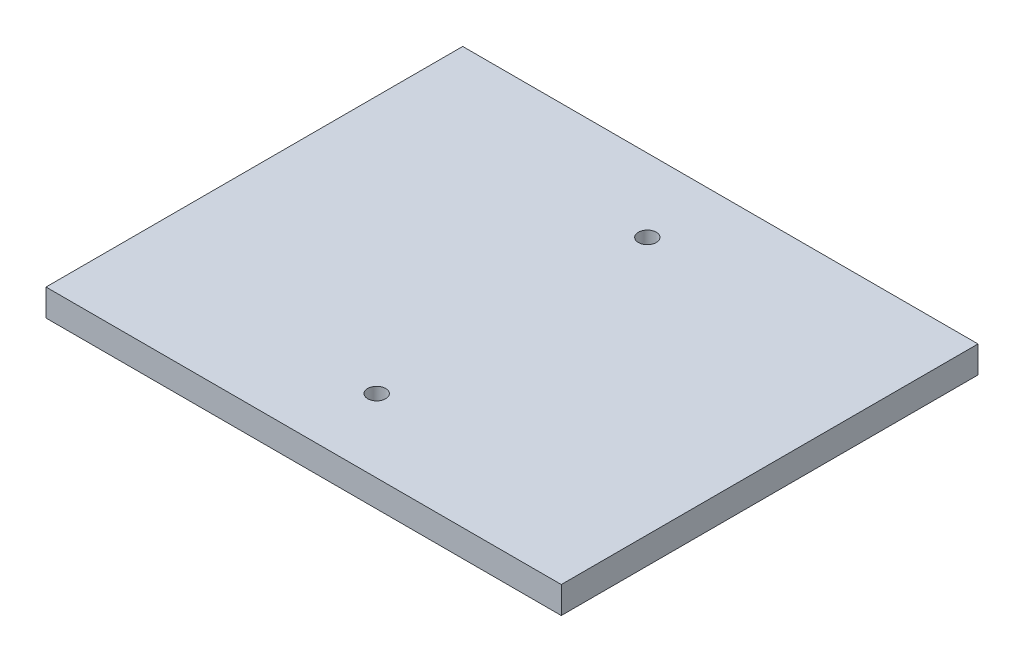
ISO-10303-21;
HEADER;
FILE_DESCRIPTION(('STEP AP214'),'2;1');
FILE_NAME('part.step','',(''),(''),'','','');
FILE_SCHEMA(('AUTOMOTIVE_DESIGN { 1 0 10303 214 1 1 1 1 }'));
ENDSEC;
DATA;
#1=APPLICATION_CONTEXT('core data for automotive mechanical design processes');
#2=APPLICATION_PROTOCOL_DEFINITION('international standard','automotive_design',2000,#1);
#3=PRODUCT_CONTEXT('',#1,'mechanical');
#4=PRODUCT('Part','Part','',(#3));
#5=PRODUCT_RELATED_PRODUCT_CATEGORY('part','',(#4));
#6=PRODUCT_DEFINITION_FORMATION('','',#4);
#7=PRODUCT_DEFINITION_CONTEXT('part definition',#1,'design');
#8=PRODUCT_DEFINITION('design','',#6,#7);
#9=PRODUCT_DEFINITION_SHAPE('','',#8);
#10=(LENGTH_UNIT() NAMED_UNIT(*) SI_UNIT(.MILLI.,.METRE.));
#11=(NAMED_UNIT(*) PLANE_ANGLE_UNIT() SI_UNIT($,.RADIAN.));
#12=(NAMED_UNIT(*) SI_UNIT($,.STERADIAN.) SOLID_ANGLE_UNIT());
#13=UNCERTAINTY_MEASURE_WITH_UNIT(LENGTH_MEASURE(1.E-05),#10,'distance_accuracy_value','');
#14=(GEOMETRIC_REPRESENTATION_CONTEXT(3) GLOBAL_UNCERTAINTY_ASSIGNED_CONTEXT((#13)) GLOBAL_UNIT_ASSIGNED_CONTEXT((#10,
#11,#12)) REPRESENTATION_CONTEXT('',''));
#15=CARTESIAN_POINT('',(0.,0.,0.));
#16=DIRECTION('',(0.,0.,1.));
#17=DIRECTION('',(1.,0.,0.));
#18=AXIS2_PLACEMENT_3D('',#15,#16,#17);
#19=CARTESIAN_POINT('',(-28.75,3.,23.25));
#20=DIRECTION('',(-1.,0.,0.));
#21=DIRECTION('',(0.,0.,1.));
#22=AXIS2_PLACEMENT_3D('',#19,#20,#21);
#23=PLANE('',#22);
#24=DIRECTION('',(0.,0.,-1.));
#25=VECTOR('',#24,1.);
#26=CARTESIAN_POINT('',(-28.75,0.,23.25));
#27=LINE('',#26,#25);
#28=CARTESIAN_POINT('',(-28.75,0.,23.25));
#29=VERTEX_POINT('',#28);
#30=CARTESIAN_POINT('',(-28.75,0.,-23.25));
#31=VERTEX_POINT('',#30);
#32=EDGE_CURVE('E105',#29,#31,#27,.T.);
#33=ORIENTED_EDGE('',*,*,#32,.F.);
#34=DIRECTION('',(0.,-1.,0.));
#35=VECTOR('',#34,1.);
#36=CARTESIAN_POINT('',(-28.75,3.,23.25));
#37=LINE('',#36,#35);
#38=CARTESIAN_POINT('',(-28.75,3.,23.25));
#39=VERTEX_POINT('',#38);
#40=EDGE_CURVE('E11',#39,#29,#37,.T.);
#41=ORIENTED_EDGE('',*,*,#40,.F.);
#42=DIRECTION('',(0.,0.,-1.));
#43=VECTOR('',#42,1.);
#44=CARTESIAN_POINT('',(-28.75,3.,23.25));
#45=LINE('',#44,#43);
#46=CARTESIAN_POINT('',(-28.75,3.,-23.25));
#47=VERTEX_POINT('',#46);
#48=EDGE_CURVE('E99',#39,#47,#45,.T.);
#49=ORIENTED_EDGE('',*,*,#48,.T.);
#50=DIRECTION('',(0.,-1.,0.));
#51=VECTOR('',#50,1.);
#52=CARTESIAN_POINT('',(-28.75,3.,-23.25));
#53=LINE('',#52,#51);
#54=EDGE_CURVE('E42',#47,#31,#53,.T.);
#55=ORIENTED_EDGE('',*,*,#54,.T.);
#56=EDGE_LOOP('',(#33,#41,#49,#55));
#57=FACE_BOUND('',#56,.T.);
#58=ADVANCED_FACE('F39',(#57),#23,.T.);
#59=CARTESIAN_POINT('',(-28.75,3.,23.25));
#60=DIRECTION('',(0.,0.,-1.));
#61=DIRECTION('',(-1.,0.,0.));
#62=AXIS2_PLACEMENT_3D('',#59,#60,#61);
#63=PLANE('',#62);
#64=DIRECTION('',(1.,0.,0.));
#65=VECTOR('',#64,1.);
#66=CARTESIAN_POINT('',(-28.75,0.,23.25));
#67=LINE('',#66,#65);
#68=CARTESIAN_POINT('',(28.75,0.,23.25));
#69=VERTEX_POINT('',#68);
#70=EDGE_CURVE('E72',#29,#69,#67,.T.);
#71=ORIENTED_EDGE('',*,*,#70,.T.);
#72=DIRECTION('',(0.,-1.,0.));
#73=VECTOR('',#72,1.);
#74=CARTESIAN_POINT('',(28.75,3.,23.25));
#75=LINE('',#74,#73);
#76=CARTESIAN_POINT('',(28.75,3.,23.25));
#77=VERTEX_POINT('',#76);
#78=EDGE_CURVE('E48',#77,#69,#75,.T.);
#79=ORIENTED_EDGE('',*,*,#78,.F.);
#80=DIRECTION('',(1.,0.,0.));
#81=VECTOR('',#80,1.);
#82=CARTESIAN_POINT('',(-28.75,3.,23.25));
#83=LINE('',#82,#81);
#84=EDGE_CURVE('E89',#39,#77,#83,.T.);
#85=ORIENTED_EDGE('',*,*,#84,.F.);
#86=ORIENTED_EDGE('',*,*,#40,.T.);
#87=EDGE_LOOP('',(#71,#79,#85,#86));
#88=FACE_BOUND('',#87,.T.);
#89=ADVANCED_FACE('F116',(#88),#63,.F.);
#90=CARTESIAN_POINT('',(28.75,3.,23.25));
#91=DIRECTION('',(-1.,0.,0.));
#92=DIRECTION('',(0.,0.,1.));
#93=AXIS2_PLACEMENT_3D('',#90,#91,#92);
#94=PLANE('',#93);
#95=DIRECTION('',(0.,0.,-1.));
#96=VECTOR('',#95,1.);
#97=CARTESIAN_POINT('',(28.75,0.,23.25));
#98=LINE('',#97,#96);
#99=CARTESIAN_POINT('',(28.75,0.,-23.25));
#100=VERTEX_POINT('',#99);
#101=EDGE_CURVE('E96',#69,#100,#98,.T.);
#102=ORIENTED_EDGE('',*,*,#101,.T.);
#103=DIRECTION('',(0.,-1.,0.));
#104=VECTOR('',#103,1.);
#105=CARTESIAN_POINT('',(28.75,3.,-23.25));
#106=LINE('',#105,#104);
#107=CARTESIAN_POINT('',(28.75,3.,-23.25));
#108=VERTEX_POINT('',#107);
#109=EDGE_CURVE('E93',#108,#100,#106,.T.);
#110=ORIENTED_EDGE('',*,*,#109,.F.);
#111=DIRECTION('',(0.,0.,-1.));
#112=VECTOR('',#111,1.);
#113=CARTESIAN_POINT('',(28.75,3.,23.25));
#114=LINE('',#113,#112);
#115=EDGE_CURVE('E84',#77,#108,#114,.T.);
#116=ORIENTED_EDGE('',*,*,#115,.F.);
#117=ORIENTED_EDGE('',*,*,#78,.T.);
#118=EDGE_LOOP('',(#102,#110,#116,#117));
#119=FACE_BOUND('',#118,.T.);
#120=ADVANCED_FACE('F94',(#119),#94,.F.);
#121=CARTESIAN_POINT('',(-28.75,3.,-23.25));
#122=DIRECTION('',(0.,0.,-1.));
#123=DIRECTION('',(-1.,0.,0.));
#124=AXIS2_PLACEMENT_3D('',#121,#122,#123);
#125=PLANE('',#124);
#126=DIRECTION('',(1.,0.,0.));
#127=VECTOR('',#126,1.);
#128=CARTESIAN_POINT('',(-28.75,0.,-23.25));
#129=LINE('',#128,#127);
#130=EDGE_CURVE('E108',#31,#100,#129,.T.);
#131=ORIENTED_EDGE('',*,*,#130,.F.);
#132=ORIENTED_EDGE('',*,*,#54,.F.);
#133=DIRECTION('',(1.,0.,0.));
#134=VECTOR('',#133,1.);
#135=CARTESIAN_POINT('',(-28.75,3.,-23.25));
#136=LINE('',#135,#134);
#137=EDGE_CURVE('E88',#47,#108,#136,.T.);
#138=ORIENTED_EDGE('',*,*,#137,.T.);
#139=ORIENTED_EDGE('',*,*,#109,.T.);
#140=EDGE_LOOP('',(#131,#132,#138,#139));
#141=FACE_BOUND('',#140,.T.);
#142=ADVANCED_FACE('F98',(#141),#125,.T.);
#143=CARTESIAN_POINT('',(0.,3.,0.));
#144=DIRECTION('',(0.,-1.,0.));
#145=DIRECTION('',(0.,0.,-1.));
#146=AXIS2_PLACEMENT_3D('',#143,#144,#145);
#147=PLANE('',#146);
#148=CARTESIAN_POINT('',(0.,3.,15.1));
#149=DIRECTION('',(0.,1.,0.));
#150=DIRECTION('',(0.,0.,1.));
#151=AXIS2_PLACEMENT_3D('',#148,#149,#150);
#152=CIRCLE('',#151,1.);
#153=CARTESIAN_POINT('',(0.,3.,16.1));
#154=VERTEX_POINT('',#153);
#155=EDGE_CURVE('E213',#154,#154,#152,.T.);
#156=ORIENTED_EDGE('',*,*,#155,.F.);
#157=EDGE_LOOP('',(#156));
#158=FACE_BOUND('',#157,.T.);
#159=CARTESIAN_POINT('',(0.,3.,-15.1));
#160=DIRECTION('',(0.,1.,0.));
#161=DIRECTION('',(0.,0.,1.));
#162=AXIS2_PLACEMENT_3D('',#159,#160,#161);
#163=CIRCLE('',#162,1.);
#164=CARTESIAN_POINT('',(0.,3.,-14.1));
#165=VERTEX_POINT('',#164);
#166=EDGE_CURVE('E216',#165,#165,#163,.T.);
#167=ORIENTED_EDGE('',*,*,#166,.F.);
#168=EDGE_LOOP('',(#167));
#169=FACE_BOUND('',#168,.T.);
#170=ORIENTED_EDGE('',*,*,#48,.F.);
#171=ORIENTED_EDGE('',*,*,#84,.T.);
#172=ORIENTED_EDGE('',*,*,#115,.T.);
#173=ORIENTED_EDGE('',*,*,#137,.F.);
#174=EDGE_LOOP('',(#170,#171,#172,#173));
#175=FACE_BOUND('',#174,.T.);
#176=ADVANCED_FACE('F87',(#158,#169,#175),#147,.F.);
#177=CARTESIAN_POINT('',(0.,0.,0.));
#178=DIRECTION('',(0.,-1.,0.));
#179=DIRECTION('',(0.,0.,-1.));
#180=AXIS2_PLACEMENT_3D('',#177,#178,#179);
#181=PLANE('',#180);
#182=CARTESIAN_POINT('',(20.75,0.,15.25));
#183=DIRECTION('',(0.,-1.,0.));
#184=DIRECTION('',(0.,0.,1.));
#185=AXIS2_PLACEMENT_3D('',#182,#183,#184);
#186=CIRCLE('',#185,2.6);
#187=CARTESIAN_POINT('',(20.75,0.,17.85));
#188=VERTEX_POINT('',#187);
#189=EDGE_CURVE('E196',#188,#188,#186,.T.);
#190=ORIENTED_EDGE('',*,*,#189,.F.);
#191=EDGE_LOOP('',(#190));
#192=FACE_BOUND('',#191,.T.);
#193=CARTESIAN_POINT('',(-20.75,0.,-15.25));
#194=DIRECTION('',(0.,-1.,0.));
#195=DIRECTION('',(0.,0.,1.));
#196=AXIS2_PLACEMENT_3D('',#193,#194,#195);
#197=CIRCLE('',#196,2.6);
#198=CARTESIAN_POINT('',(-20.75,0.,-12.65));
#199=VERTEX_POINT('',#198);
#200=EDGE_CURVE('E192',#199,#199,#197,.T.);
#201=ORIENTED_EDGE('',*,*,#200,.F.);
#202=EDGE_LOOP('',(#201));
#203=FACE_BOUND('',#202,.T.);
#204=CARTESIAN_POINT('',(20.75,0.,-15.25));
#205=DIRECTION('',(0.,-1.,0.));
#206=DIRECTION('',(0.,0.,-1.));
#207=AXIS2_PLACEMENT_3D('',#204,#205,#206);
#208=CIRCLE('',#207,2.6);
#209=CARTESIAN_POINT('',(20.75,0.,-17.85));
#210=VERTEX_POINT('',#209);
#211=EDGE_CURVE('E187',#210,#210,#208,.T.);
#212=ORIENTED_EDGE('',*,*,#211,.F.);
#213=EDGE_LOOP('',(#212));
#214=FACE_BOUND('',#213,.T.);
#215=CARTESIAN_POINT('',(-20.75,0.,15.25));
#216=DIRECTION('',(0.,-1.,0.));
#217=DIRECTION('',(0.,0.,-1.));
#218=AXIS2_PLACEMENT_3D('',#215,#216,#217);
#219=CIRCLE('',#218,2.6);
#220=CARTESIAN_POINT('',(-20.75,0.,12.65));
#221=VERTEX_POINT('',#220);
#222=EDGE_CURVE('E199',#221,#221,#219,.T.);
#223=ORIENTED_EDGE('',*,*,#222,.F.);
#224=EDGE_LOOP('',(#223));
#225=FACE_BOUND('',#224,.T.);
#226=CARTESIAN_POINT('',(0.,0.,15.1));
#227=DIRECTION('',(0.,1.,0.));
#228=DIRECTION('',(0.,0.,1.));
#229=AXIS2_PLACEMENT_3D('',#226,#227,#228);
#230=CIRCLE('',#229,1.);
#231=CARTESIAN_POINT('',(0.,0.,16.1));
#232=VERTEX_POINT('',#231);
#233=EDGE_CURVE('E109',#232,#232,#230,.T.);
#234=ORIENTED_EDGE('',*,*,#233,.T.);
#235=EDGE_LOOP('',(#234));
#236=FACE_BOUND('',#235,.T.);
#237=CARTESIAN_POINT('',(0.,0.,-15.1));
#238=DIRECTION('',(0.,1.,0.));
#239=DIRECTION('',(0.,0.,1.));
#240=AXIS2_PLACEMENT_3D('',#237,#238,#239);
#241=CIRCLE('',#240,1.);
#242=CARTESIAN_POINT('',(0.,0.,-14.1));
#243=VERTEX_POINT('',#242);
#244=EDGE_CURVE('E208',#243,#243,#241,.T.);
#245=ORIENTED_EDGE('',*,*,#244,.T.);
#246=EDGE_LOOP('',(#245));
#247=FACE_BOUND('',#246,.T.);
#248=ORIENTED_EDGE('',*,*,#32,.T.);
#249=ORIENTED_EDGE('',*,*,#130,.T.);
#250=ORIENTED_EDGE('',*,*,#101,.F.);
#251=ORIENTED_EDGE('',*,*,#70,.F.);
#252=EDGE_LOOP('',(#248,#249,#250,#251));
#253=FACE_BOUND('',#252,.T.);
#254=ADVANCED_FACE('F114',(#192,#203,#214,#225,#236,#247,#253),#181,.T.);
#255=CARTESIAN_POINT('',(0.,0.,-15.1));
#256=DIRECTION('',(0.,1.,0.));
#257=DIRECTION('',(0.,0.,1.));
#258=AXIS2_PLACEMENT_3D('',#255,#256,#257);
#259=CYLINDRICAL_SURFACE('',#258,1.);
#260=ORIENTED_EDGE('',*,*,#244,.F.);
#261=EDGE_LOOP('',(#260));
#262=FACE_BOUND('',#261,.T.);
#263=ORIENTED_EDGE('',*,*,#166,.T.);
#264=EDGE_LOOP('',(#263));
#265=FACE_BOUND('',#264,.T.);
#266=ADVANCED_FACE('F136',(#262,#265),#259,.F.);
#267=CARTESIAN_POINT('',(0.,0.,15.1));
#268=DIRECTION('',(0.,1.,0.));
#269=DIRECTION('',(0.,0.,1.));
#270=AXIS2_PLACEMENT_3D('',#267,#268,#269);
#271=CYLINDRICAL_SURFACE('',#270,1.);
#272=ORIENTED_EDGE('',*,*,#233,.F.);
#273=EDGE_LOOP('',(#272));
#274=FACE_BOUND('',#273,.T.);
#275=ORIENTED_EDGE('',*,*,#155,.T.);
#276=EDGE_LOOP('',(#275));
#277=FACE_BOUND('',#276,.T.);
#278=ADVANCED_FACE('F143',(#274,#277),#271,.F.);
#279=CARTESIAN_POINT('',(-20.75,0.8,15.25));
#280=DIRECTION('',(0.,-1.,0.));
#281=DIRECTION('',(0.,0.,-1.));
#282=AXIS2_PLACEMENT_3D('',#279,#280,#281);
#283=CYLINDRICAL_SURFACE('',#282,2.6);
#284=CARTESIAN_POINT('',(-20.75,0.8,15.25));
#285=DIRECTION('',(0.,-1.,0.));
#286=DIRECTION('',(0.,0.,-1.));
#287=AXIS2_PLACEMENT_3D('',#284,#285,#286);
#288=CIRCLE('',#287,2.6);
#289=CARTESIAN_POINT('',(-20.75,0.8,12.65));
#290=VERTEX_POINT('',#289);
#291=EDGE_CURVE('E205',#290,#290,#288,.T.);
#292=ORIENTED_EDGE('',*,*,#291,.F.);
#293=EDGE_LOOP('',(#292));
#294=FACE_BOUND('',#293,.T.);
#295=ORIENTED_EDGE('',*,*,#222,.T.);
#296=EDGE_LOOP('',(#295));
#297=FACE_BOUND('',#296,.T.);
#298=ADVANCED_FACE('F147',(#294,#297),#283,.F.);
#299=CARTESIAN_POINT('',(-20.75,0.8,15.25));
#300=DIRECTION('',(0.,-1.,0.));
#301=DIRECTION('',(0.,0.,-1.));
#302=AXIS2_PLACEMENT_3D('',#299,#300,#301);
#303=PLANE('',#302);
#304=ORIENTED_EDGE('',*,*,#291,.T.);
#305=EDGE_LOOP('',(#304));
#306=FACE_BOUND('',#305,.T.);
#307=ADVANCED_FACE('F151',(#306),#303,.T.);
#308=CARTESIAN_POINT('',(20.75,0.8,-15.25));
#309=DIRECTION('',(0.,-1.,0.));
#310=DIRECTION('',(0.,0.,-1.));
#311=AXIS2_PLACEMENT_3D('',#308,#309,#310);
#312=CYLINDRICAL_SURFACE('',#311,2.6);
#313=CARTESIAN_POINT('',(20.75,0.8,-15.25));
#314=DIRECTION('',(0.,-1.,0.));
#315=DIRECTION('',(0.,0.,-1.));
#316=AXIS2_PLACEMENT_3D('',#313,#314,#315);
#317=CIRCLE('',#316,2.6);
#318=CARTESIAN_POINT('',(20.75,0.8,-17.85));
#319=VERTEX_POINT('',#318);
#320=EDGE_CURVE('E184',#319,#319,#317,.T.);
#321=ORIENTED_EDGE('',*,*,#320,.F.);
#322=EDGE_LOOP('',(#321));
#323=FACE_BOUND('',#322,.T.);
#324=ORIENTED_EDGE('',*,*,#211,.T.);
#325=EDGE_LOOP('',(#324));
#326=FACE_BOUND('',#325,.T.);
#327=ADVANCED_FACE('F155',(#323,#326),#312,.F.);
#328=CARTESIAN_POINT('',(20.75,0.8,-15.25));
#329=DIRECTION('',(0.,-1.,0.));
#330=DIRECTION('',(0.,0.,-1.));
#331=AXIS2_PLACEMENT_3D('',#328,#329,#330);
#332=PLANE('',#331);
#333=ORIENTED_EDGE('',*,*,#320,.T.);
#334=EDGE_LOOP('',(#333));
#335=FACE_BOUND('',#334,.T.);
#336=ADVANCED_FACE('F165',(#335),#332,.T.);
#337=CARTESIAN_POINT('',(-20.75,0.8,-15.25));
#338=DIRECTION('',(0.,-1.,0.));
#339=DIRECTION('',(0.,0.,-1.));
#340=AXIS2_PLACEMENT_3D('',#337,#338,#339);
#341=CYLINDRICAL_SURFACE('',#340,2.6);
#342=CARTESIAN_POINT('',(-20.75,0.8,-15.25));
#343=DIRECTION('',(0.,-1.,0.));
#344=DIRECTION('',(0.,0.,1.));
#345=AXIS2_PLACEMENT_3D('',#342,#343,#344);
#346=CIRCLE('',#345,2.6);
#347=CARTESIAN_POINT('',(-20.75,0.8,-12.65));
#348=VERTEX_POINT('',#347);
#349=EDGE_CURVE('E189',#348,#348,#346,.T.);
#350=ORIENTED_EDGE('',*,*,#349,.F.);
#351=EDGE_LOOP('',(#350));
#352=FACE_BOUND('',#351,.T.);
#353=ORIENTED_EDGE('',*,*,#200,.T.);
#354=EDGE_LOOP('',(#353));
#355=FACE_BOUND('',#354,.T.);
#356=ADVANCED_FACE('F161',(#352,#355),#341,.F.);
#357=CARTESIAN_POINT('',(-20.75,0.8,-15.25));
#358=DIRECTION('',(0.,1.,0.));
#359=DIRECTION('',(0.,0.,1.));
#360=AXIS2_PLACEMENT_3D('',#357,#358,#359);
#361=PLANE('',#360);
#362=ORIENTED_EDGE('',*,*,#349,.T.);
#363=EDGE_LOOP('',(#362));
#364=FACE_BOUND('',#363,.T.);
#365=ADVANCED_FACE('F157',(#364),#361,.F.);
#366=CARTESIAN_POINT('',(20.75,0.8,15.25));
#367=DIRECTION('',(0.,-1.,0.));
#368=DIRECTION('',(0.,0.,-1.));
#369=AXIS2_PLACEMENT_3D('',#366,#367,#368);
#370=CYLINDRICAL_SURFACE('',#369,2.6);
#371=CARTESIAN_POINT('',(20.75,0.8,15.25));
#372=DIRECTION('',(0.,-1.,0.));
#373=DIRECTION('',(0.,0.,1.));
#374=AXIS2_PLACEMENT_3D('',#371,#372,#373);
#375=CIRCLE('',#374,2.6);
#376=CARTESIAN_POINT('',(20.75,0.8,17.85));
#377=VERTEX_POINT('',#376);
#378=EDGE_CURVE('E200',#377,#377,#375,.T.);
#379=ORIENTED_EDGE('',*,*,#378,.F.);
#380=EDGE_LOOP('',(#379));
#381=FACE_BOUND('',#380,.T.);
#382=ORIENTED_EDGE('',*,*,#189,.T.);
#383=EDGE_LOOP('',(#382));
#384=FACE_BOUND('',#383,.T.);
#385=ADVANCED_FACE('F160',(#381,#384),#370,.F.);
#386=CARTESIAN_POINT('',(20.75,0.8,15.25));
#387=DIRECTION('',(0.,1.,0.));
#388=DIRECTION('',(0.,0.,1.));
#389=AXIS2_PLACEMENT_3D('',#386,#387,#388);
#390=PLANE('',#389);
#391=ORIENTED_EDGE('',*,*,#378,.T.);
#392=EDGE_LOOP('',(#391));
#393=FACE_BOUND('',#392,.T.);
#394=ADVANCED_FACE('F167',(#393),#390,.F.);
#395=CLOSED_SHELL('',(#58,#89,#120,#142,#176,#254,#266,#278,#298,#307,#327,#336,#356,#365,#385,#394));
#396=MANIFOLD_SOLID_BREP('B2',#395);
#397=ADVANCED_BREP_SHAPE_REPRESENTATION('',(#18,#396),#14);
#398=SHAPE_DEFINITION_REPRESENTATION(#9,#397);
ENDSEC;
END-ISO-10303-21;
